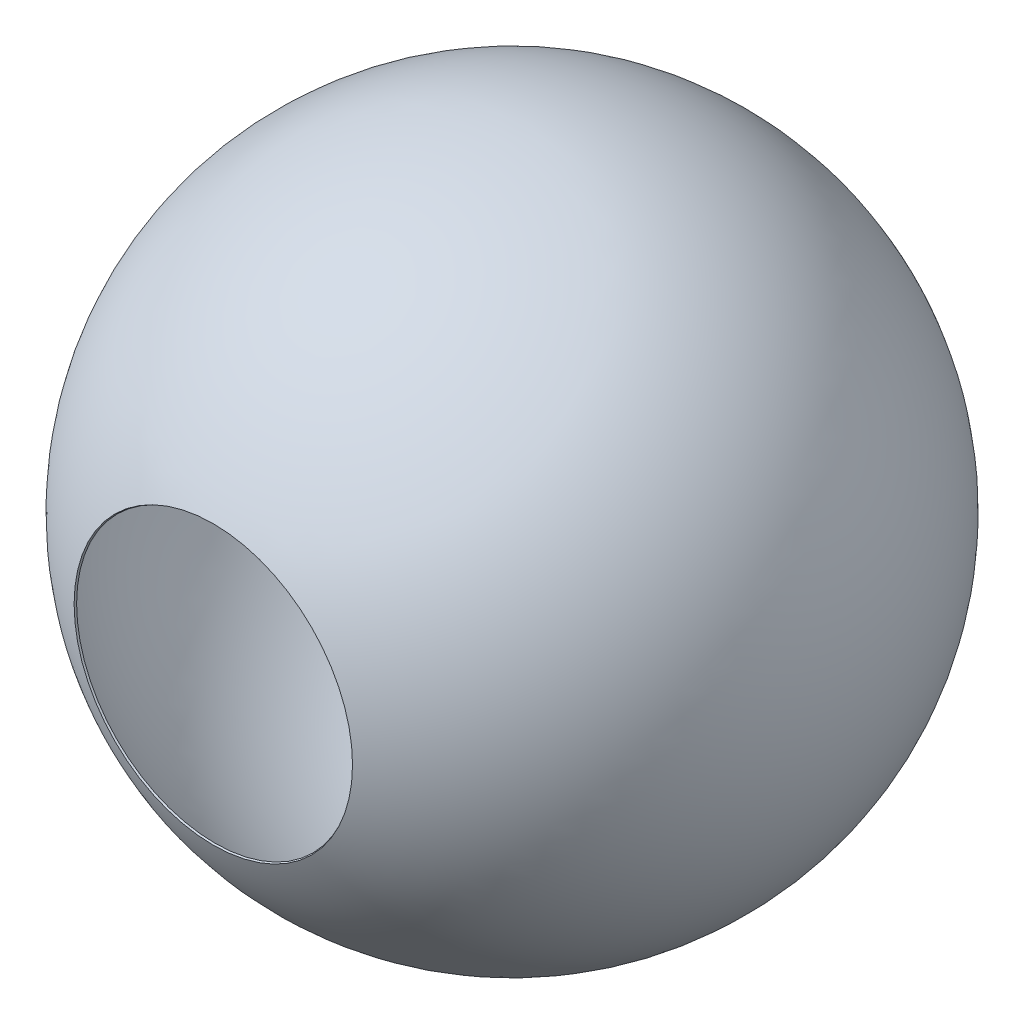
ISO-10303-21;
HEADER;
FILE_DESCRIPTION(('STEP AP214'),'2;1');
FILE_NAME('part.step','',(''),(''),'','','');
FILE_SCHEMA(('AUTOMOTIVE_DESIGN { 1 0 10303 214 1 1 1 1 }'));
ENDSEC;
DATA;
#1=APPLICATION_CONTEXT('core data for automotive mechanical design processes');
#2=APPLICATION_PROTOCOL_DEFINITION('international standard','automotive_design',2000,#1);
#3=PRODUCT_CONTEXT('',#1,'mechanical');
#4=PRODUCT('Part','Part','',(#3));
#5=PRODUCT_RELATED_PRODUCT_CATEGORY('part','',(#4));
#6=PRODUCT_DEFINITION_FORMATION('','',#4);
#7=PRODUCT_DEFINITION_CONTEXT('part definition',#1,'design');
#8=PRODUCT_DEFINITION('design','',#6,#7);
#9=PRODUCT_DEFINITION_SHAPE('','',#8);
#10=(LENGTH_UNIT() NAMED_UNIT(*) SI_UNIT(.MILLI.,.METRE.));
#11=(NAMED_UNIT(*) PLANE_ANGLE_UNIT() SI_UNIT($,.RADIAN.));
#12=(NAMED_UNIT(*) SI_UNIT($,.STERADIAN.) SOLID_ANGLE_UNIT());
#13=UNCERTAINTY_MEASURE_WITH_UNIT(LENGTH_MEASURE(1.E-05),#10,'distance_accuracy_value','');
#14=(GEOMETRIC_REPRESENTATION_CONTEXT(3) GLOBAL_UNCERTAINTY_ASSIGNED_CONTEXT((#13)) GLOBAL_UNIT_ASSIGNED_CONTEXT((#10,
#11,#12)) REPRESENTATION_CONTEXT('',''));
#15=CARTESIAN_POINT('',(0.,0.,0.));
#16=DIRECTION('',(0.,0.,1.));
#17=DIRECTION('',(1.,0.,0.));
#18=AXIS2_PLACEMENT_3D('',#15,#16,#17);
#19=CARTESIAN_POINT('',(0.,125.,-531.601551916471));
#20=DIRECTION('',(0.,0.,1.));
#21=DIRECTION('',(0.,-1.,0.));
#22=AXIS2_PLACEMENT_3D('',#19,#20,#21);
#23=PLANE('',#22);
#24=CARTESIAN_POINT('',(0.,3.19189119579733E-13,-531.601551916471));
#25=DIRECTION('',(0.,0.,1.));
#26=DIRECTION('',(0.,-1.,0.));
#27=AXIS2_PLACEMENT_3D('',#24,#25,#26);
#28=CIRCLE('',#27,125.);
#29=CARTESIAN_POINT('',(0.,125.,-531.601551916471));
#30=VERTEX_POINT('',#29);
#31=EDGE_CURVE('E10',#30,#30,#28,.T.);
#32=ORIENTED_EDGE('',*,*,#31,.F.);
#33=EDGE_LOOP('',(#32));
#34=FACE_BOUND('',#33,.T.);
#35=ADVANCED_FACE('F30',(#34),#23,.F.);
#36=CARTESIAN_POINT('',(0.,0.,0.));
#37=DIRECTION('',(0.,0.,1.));
#38=DIRECTION('',(0.,1.,0.));
#39=AXIS2_PLACEMENT_3D('',#36,#37,#38);
#40=SPHERICAL_SURFACE('',#39,546.1);
#41=CARTESIAN_POINT('',(0.,0.,495.));
#42=DIRECTION('',(0.,0.,1.));
#43=DIRECTION('',(0.,-1.,0.));
#44=AXIS2_PLACEMENT_3D('',#41,#42,#43);
#45=CIRCLE('',#44,230.651707125701);
#46=CARTESIAN_POINT('',(0.,230.6517071257,495.));
#47=VERTEX_POINT('',#46);
#48=EDGE_CURVE('E36',#47,#47,#45,.T.);
#49=CARTESIAN_POINT('',(0.,230.6517071257,495.));
#50=CARTESIAN_POINT('',(0.,233.841623475158,493.513621901903));
#51=CARTESIAN_POINT('',(0.,237.017167923415,491.996400730098));
#52=CARTESIAN_POINT('',(0.,243.338334990175,488.900857304928));
#53=CARTESIAN_POINT('',(0.,246.483957608678,487.322535051562));
#54=CARTESIAN_POINT('',(0.,252.744102988575,484.105374529126));
#55=CARTESIAN_POINT('',(0.,255.85862574997,482.466536260054));
#56=CARTESIAN_POINT('',(0.,262.055408008267,479.128957508647));
#57=CARTESIAN_POINT('',(0.,265.13766750517,477.430217026311));
#58=CARTESIAN_POINT('',(0.,271.268771082452,473.973468399462));
#59=CARTESIAN_POINT('',(0.,274.317615162832,472.215460254949));
#60=CARTESIAN_POINT('',(0.,280.380748459058,468.640833445209));
#61=CARTESIAN_POINT('',(0.,283.395037674904,466.824214779983));
#62=CARTESIAN_POINT('',(0.,289.387934651151,463.133045858016));
#63=CARTESIAN_POINT('',(0.,292.366542411552,461.258495601275));
#64=CARTESIAN_POINT('',(0.,298.286963237245,457.452164108727));
#65=CARTESIAN_POINT('',(0.,301.228776302538,455.520382872918));
#66=CARTESIAN_POINT('',(0.,307.074508246087,451.600311416081));
#67=CARTESIAN_POINT('',(0.,309.978427124342,449.612021195052));
#68=CARTESIAN_POINT('',(0.,315.747285365801,445.579674883896));
#69=CARTESIAN_POINT('',(0.,318.612224729004,443.535618793769));
#70=CARTESIAN_POINT('',(0.,324.302053180482,439.392504702207));
#71=CARTESIAN_POINT('',(0.,327.126942268758,437.293446700772));
#72=CARTESIAN_POINT('',(0.,332.735614379223,433.041113301295));
#73=CARTESIAN_POINT('',(0.,335.519397401411,430.887837903252));
#74=CARTESIAN_POINT('',(0.,341.044816951747,426.527874488755));
#75=CARTESIAN_POINT('',(0.,343.786453479896,424.321186472301));
#76=CARTESIAN_POINT('',(0.,349.226555366293,419.855222561943));
#77=CARTESIAN_POINT('',(0.,351.925020724542,417.59594666804));
#78=CARTESIAN_POINT('',(0.,357.277771730332,413.025651398257));
#79=CARTESIAN_POINT('',(0.,359.932057377874,410.714632022377));
#80=CARTESIAN_POINT('',(0.,365.195456933438,406.041713523036));
#81=CARTESIAN_POINT('',(0.,367.804570841461,403.679814399574));
#82=CARTESIAN_POINT('',(0.,372.976651771931,398.906019155572));
#83=CARTESIAN_POINT('',(0.,375.539618794379,396.494123035031));
#84=CARTESIAN_POINT('',(0.,380.618448054866,391.621235233549));
#85=CARTESIAN_POINT('',(0.,383.134310292904,389.16024355261));
#86=CARTESIAN_POINT('',(0.,388.117989690961,384.190084416286));
#87=CARTESIAN_POINT('',(0.,390.585806850979,381.680916960902));
#88=CARTESIAN_POINT('',(0.,395.472473756047,376.615344067151));
#89=CARTESIAN_POINT('',(0.,397.891323501096,374.058938628783));
#90=CARTESIAN_POINT('',(0.,402.679151540654,368.899845215534));
#91=CARTESIAN_POINT('',(0.,405.048129835162,366.297157240653));
#92=CARTESIAN_POINT('',(0.,409.735329577323,361.046471498764));
#93=CARTESIAN_POINT('',(0.,412.053551024977,358.398473731756));
#94=CARTESIAN_POINT('',(0.,416.638370647289,353.058158084356));
#95=CARTESIAN_POINT('',(0.,418.904968821946,350.365840203964));
#96=CARTESIAN_POINT('',(0.,423.38569476612,344.937890573007));
#97=CARTESIAN_POINT('',(0.,425.599822535635,342.202258822442));
#98=CARTESIAN_POINT('',(0.,429.974780147985,336.688703882737));
#99=CARTESIAN_POINT('',(0.,432.135609990819,333.910780693598));
#100=CARTESIAN_POINT('',(0.,436.403164148158,328.313681114604));
#101=CARTESIAN_POINT('',(0.,438.509888462662,325.494504724748));
#102=CARTESIAN_POINT('',(0.,442.66844418342,319.815952400401));
#103=CARTESIAN_POINT('',(0.,444.720275589674,316.95657646591));
#104=CARTESIAN_POINT('',(0.,448.768278630019,311.19869373279));
#105=CARTESIAN_POINT('',(0.,450.764450264111,308.300186934163));
#106=CARTESIAN_POINT('',(0.,454.70038769884,302.46512577828));
#107=CARTESIAN_POINT('',(0.,456.640153499477,299.528571421024));
#108=CARTESIAN_POINT('',(0.,460.462554287466,293.618512673517));
#109=CARTESIAN_POINT('',(0.,462.345189274817,290.645008283266));
#110=CARTESIAN_POINT('',(0.,466.052624808815,284.66216080533));
#111=CARTESIAN_POINT('',(0.,467.877425355463,281.652817717646));
#112=CARTESIAN_POINT('',(0.,471.468509996033,275.599417574977));
#113=CARTESIAN_POINT('',(0.,473.234794089955,272.555360519993));
#114=CARTESIAN_POINT('',(0.,476.708185683347,266.433670147069));
#115=CARTESIAN_POINT('',(0.,478.415293182816,263.356036829129));
#116=CARTESIAN_POINT('',(0.,481.769693562594,257.168344183631));
#117=CARTESIAN_POINT('',(0.,483.416986442901,254.058284856073));
#118=CARTESIAN_POINT('',(0.,486.651141915124,247.806902563773));
#119=CARTESIAN_POINT('',(0.,488.23800450704,244.66557959903));
#120=CARTESIAN_POINT('',(0.,491.350706318831,238.352844089454));
#121=CARTESIAN_POINT('',(0.,492.876545538707,235.18143154462));
#122=CARTESIAN_POINT('',(0.,495.866630330016,228.809702177817));
#123=CARTESIAN_POINT('',(0.,497.330875901449,225.609385355848));
#124=CARTESIAN_POINT('',(0.,500.197226139854,219.18104354059));
#125=CARTESIAN_POINT('',(0.,501.599330806825,215.953018547301));
#126=CARTESIAN_POINT('',(0.,504.340875205206,209.47046685104));
#127=CARTESIAN_POINT('',(0.,505.680314936615,206.215940148067));
#128=CARTESIAN_POINT('',(0.,508.296028853545,199.681601398983));
#129=CARTESIAN_POINT('',(0.,509.572303039064,196.401789352872));
#130=CARTESIAN_POINT('',(0.,512.061208861761,189.818105734353));
#131=CARTESIAN_POINT('',(0.,513.273840498937,186.514234161946));
#132=CARTESIAN_POINT('',(0.,515.635008008646,179.883666299833));
#133=CARTESIAN_POINT('',(0.,516.783543881178,176.556970010126));
#134=CARTESIAN_POINT('',(0.,519.016090600836,169.881996053058));
#135=CARTESIAN_POINT('',(0.,520.100101447961,166.533718385696));
#136=CARTESIAN_POINT('',(0.,522.203192972019,159.816833078916));
#137=CARTESIAN_POINT('',(0.,523.222273648951,156.448225439498));
#138=CARTESIAN_POINT('',(0.,525.195123955229,149.691939192453));
#139=CARTESIAN_POINT('',(0.,526.148893584576,146.304260584825));
#140=CARTESIAN_POINT('',(0.,527.990765328038,139.511098532906));
#141=CARTESIAN_POINT('',(0.,528.878867442154,136.105615088615));
#142=CARTESIAN_POINT('',(0.,530.589072230486,129.278116149401));
#143=CARTESIAN_POINT('',(0.,531.411174904702,125.856100654479));
#144=CARTESIAN_POINT('',(0.,532.989073555595,118.996816578826));
#145=CARTESIAN_POINT('',(0.,533.744869532272,115.559547998095));
#146=CARTESIAN_POINT('',(0.,535.189872312316,108.671042416428));
#147=CARTESIAN_POINT('',(0.,535.879079115682,105.219805415491));
#148=CARTESIAN_POINT('',(0.,537.190645960776,98.3046528796575));
#149=CARTESIAN_POINT('',(0.,537.813006002503,94.8407373447602));
#150=CARTESIAN_POINT('',(0.,538.9906467197,87.9015223658021));
#151=CARTESIAN_POINT('',(0.,539.54592739517,84.4262229217412));
#152=CARTESIAN_POINT('',(0.,540.589201845888,77.4655390039443));
#153=CARTESIAN_POINT('',(0.,541.077195621135,73.9801545302082));
#154=CARTESIAN_POINT('',(0.,541.985713885654,67.0006032017894));
#155=CARTESIAN_POINT('',(0.,542.406238374926,63.5064363471067));
#156=CARTESIAN_POINT('',(0.,543.17966089812,56.5106261879034));
#157=CARTESIAN_POINT('',(0.,543.532558932043,53.0089828833828));
#158=CARTESIAN_POINT('',(0.,544.17059665029,45.9995285499064));
#159=CARTESIAN_POINT('',(0.,544.455736334613,42.4917175209505));
#160=CARTESIAN_POINT('',(0.,544.958150783825,35.4712387691687));
#161=CARTESIAN_POINT('',(0.,545.175425548714,31.9585710463428));
#162=CARTESIAN_POINT('',(0.,545.54202895347,24.9296917525564));
#163=CARTESIAN_POINT('',(0.,545.691357593336,21.413480181596));
#164=CARTESIAN_POINT('',(0.,545.922012937055,14.3788273617753));
#165=CARTESIAN_POINT('',(0.,546.003339640907,10.8603861129151));
#166=CARTESIAN_POINT('',(0.,546.097960717063,3.82258894086297));
#167=CARTESIAN_POINT('',(0.,546.111255089366,0.303233017671121));
#168=CARTESIAN_POINT('',(0.,546.069806533704,-6.7350781576202));
#169=CARTESIAN_POINT('',(0.,546.015063605738,-10.2540334097197));
#170=CARTESIAN_POINT('',(0.,545.837560909492,-17.2902280471514));
#171=CARTESIAN_POINT('',(0.,545.714801141211,-20.8074674324836));
#172=CARTESIAN_POINT('',(0.,545.401310645316,-27.8389157820045));
#173=CARTESIAN_POINT('',(0.,545.210579917701,-31.3531247461931));
#174=CARTESIAN_POINT('',(0.,544.761218787994,-38.3771988316585));
#175=CARTESIAN_POINT('',(0.,544.502588385903,-41.8870639529352));
#176=CARTESIAN_POINT('',(0.,543.91752456934,-48.9011385543025));
#177=CARTESIAN_POINT('',(0.,543.591091154868,-52.4053480343931));
#178=CARTESIAN_POINT('',(0.,542.870543316746,-59.4068016688874));
#179=CARTESIAN_POINT('',(0.,542.476428893097,-62.9040458232913));
#180=CARTESIAN_POINT('',(0.,541.620666335335,-69.8902617251748));
#181=CARTESIAN_POINT('',(0.,541.159018201223,-73.3792334726545));
#182=CARTESIAN_POINT('',(0.,540.168360761709,-80.3476005712317));
#183=CARTESIAN_POINT('',(0.,539.639351456307,-83.8269959223291));
#184=CARTESIAN_POINT('',(0.,538.514169389359,-90.7749098178244));
#185=CARTESIAN_POINT('',(0.,537.917996627814,-94.2434283622222));
#186=CARTESIAN_POINT('',(0.,536.658710465801,-101.168292299164));
#187=CARTESIAN_POINT('',(0.,535.995597065335,-104.624637691709));
#188=CARTESIAN_POINT('',(0.,534.602677461504,-111.523863529457));
#189=CARTESIAN_POINT('',(0.,533.87287125814,-114.966743974662));
#190=CARTESIAN_POINT('',(0.,532.34683881071,-121.837753154716));
#191=CARTESIAN_POINT('',(0.,531.550612566645,-125.265881889566));
#192=CARTESIAN_POINT('',(0.,529.892037624237,-132.106106399289));
#193=CARTESIAN_POINT('',(0.,529.029688925895,-135.518202174162));
#194=CARTESIAN_POINT('',(0.,527.239191374365,-142.325085506566));
#195=CARTESIAN_POINT('',(0.,526.311042521178,-145.719873064097));
#196=CARTESIAN_POINT('',(0.,524.389291551939,-152.49087117333));
#197=CARTESIAN_POINT('',(0.,523.395689435888,-155.867081725031));
#198=CARTESIAN_POINT('',(0.,521.343403295801,-162.599663977199));
#199=CARTESIAN_POINT('',(0.,520.284719271765,-165.956035677665));
#200=CARTESIAN_POINT('',(0.,518.102664994697,-172.647685796651));
#201=CARTESIAN_POINT('',(0.,516.979294741664,-175.98296421517));
#202=CARTESIAN_POINT('',(0.,514.668287861811,-182.631181223081));
#203=CARTESIAN_POINT('',(0.,513.480651234991,-185.944119812472));
#204=CARTESIAN_POINT('',(0.,511.04155548208,-192.546418964368));
#205=CARTESIAN_POINT('',(0.,509.790096355988,-195.835779526873));
#206=CARTESIAN_POINT('',(0.,507.223823332455,-202.389693239433));
#207=CARTESIAN_POINT('',(0.,505.909009435014,-205.654246389488));
#208=CARTESIAN_POINT('',(0.,503.216518275302,-212.157325163259));
#209=CARTESIAN_POINT('',(0.,501.83884101303,-215.395850786974));
#210=CARTESIAN_POINT('',(0.,499.021138025111,-221.84566412186));
#211=CARTESIAN_POINT('',(0.,497.581112299463,-225.05695183303));
#212=CARTESIAN_POINT('',(0.,494.639250588738,-231.451089136683));
#213=CARTESIAN_POINT('',(0.,493.137414603662,-234.633938729166));
#214=CARTESIAN_POINT('',(0.,490.072493679367,-240.970010217937));
#215=CARTESIAN_POINT('',(0.,488.509408740149,-244.123232114226));
#216=CARTESIAN_POINT('',(0.,485.322574104416,-250.398869706334));
#217=CARTESIAN_POINT('',(0.,483.6988244079,-253.521285402155));
#218=CARTESIAN_POINT('',(0.,480.391267127631,-259.734143602752));
#219=CARTESIAN_POINT('',(0.,478.707459543876,-262.824586107529));
#220=CARTESIAN_POINT('',(0.,475.280415805584,-268.972342885317));
#221=CARTESIAN_POINT('',(0.,473.537179651048,-272.029657158328));
#222=CARTESIAN_POINT('',(0.,469.991930298843,-278.110014813407));
#223=CARTESIAN_POINT('',(0.,468.189917101174,-281.133058195476));
#224=CARTESIAN_POINT('',(0.,464.527787158047,-287.143744218107));
#225=CARTESIAN_POINT('',(0.,462.667670412588,-290.131386858669));
#226=CARTESIAN_POINT('',(0.,458.890028585191,-296.070154778608));
#227=CARTESIAN_POINT('',(0.,456.972503503252,-299.021280057985));
#228=CARTESIAN_POINT('',(0.,453.080761670349,-304.885910284097));
#229=CARTESIAN_POINT('',(0.,451.106544919384,-307.799415230832));
#230=CARTESIAN_POINT('',(0.,447.102157604166,-313.587715880653));
#231=CARTESIAN_POINT('',(0.,445.071987039914,-316.462511583739));
#232=CARTESIAN_POINT('',(0.,440.95645086638,-322.172319302685));
#233=CARTESIAN_POINT('',(0.,438.871085257099,-325.007331318544));
#234=CARTESIAN_POINT('',(0.,434.645938390695,-330.636512088454));
#235=CARTESIAN_POINT('',(0.,432.506157133573,-333.430680842503));
#236=CARTESIAN_POINT('',(0.,428.172978706309,-338.977130779219));
#237=CARTESIAN_POINT('',(0.,425.979581536169,-341.729411961886));
#238=CARTESIAN_POINT('',(0.,421.539991056428,-347.191058101576));
#239=CARTESIAN_POINT('',(0.,419.293797746828,-349.9004230586));
#240=CARTESIAN_POINT('',(0.,414.749454494078,-355.275224132517));
#241=CARTESIAN_POINT('',(0.,412.451304550928,-357.94066024941));
#242=CARTESIAN_POINT('',(0.,407.803906955572,-363.226607446808));
#243=CARTESIAN_POINT('',(0.,405.454659303366,-365.847118527312));
#244=CARTESIAN_POINT('',(0.,400.705944311963,-371.042236246231));
#245=CARTESIAN_POINT('',(0.,398.306476972766,-373.616842884645));
#246=CARTESIAN_POINT('',(0.,393.458219398853,-378.719189470285));
#247=CARTESIAN_POINT('',(0.,391.009429164137,-381.246929417512));
#248=CARTESIAN_POINT('',(0.,386.063441024901,-386.25459788792));
#249=CARTESIAN_POINT('',(0.,383.566243120379,-388.734526411103));
#250=CARTESIAN_POINT('',(0.,378.524372959417,-393.645645169899));
#251=CARTESIAN_POINT('',(0.,375.979700702977,-396.076835405513));
#252=CARTESIAN_POINT('',(0.,370.843832899418,-400.889568941391));
#253=CARTESIAN_POINT('',(0.,368.2526373523,-403.271112241655));
#254=CARTESIAN_POINT('',(0.,363.024691416521,-407.983661814399));
#255=CARTESIAN_POINT('',(0.,360.38794102786,-410.314668086878));
#256=CARTESIAN_POINT('',(0.,355.069870884077,-414.925272399634));
#257=CARTESIAN_POINT('',(0.,352.388551128954,-417.20487043991));
#258=CARTESIAN_POINT('',(0.,346.982344384951,-421.711806297463));
#259=CARTESIAN_POINT('',(0.,344.257457396071,-423.93914411474));
#260=CARTESIAN_POINT('',(0.,338.76513460034,-428.340727067552));
#261=CARTESIAN_POINT('',(0.,335.997698793489,-430.514972203088));
#262=CARTESIAN_POINT('',(0.,330.421312680057,-434.809557176856));
#263=CARTESIAN_POINT('',(0.,327.612362373476,-436.929897015089));
#264=CARTESIAN_POINT('',(0.,321.953997094704,-441.115878925583));
#265=CARTESIAN_POINT('',(0.,319.104582122513,-443.181520997844));
#266=CARTESIAN_POINT('',(0.,313.366352470152,-447.2573353508));
#267=CARTESIAN_POINT('',(0.,310.477537789982,-449.267507631496));
#268=CARTESIAN_POINT('',(0.,304.66158840478,-453.231631107343));
#269=CARTESIAN_POINT('',(0.,301.734453699747,-455.185582302494));
#270=CARTESIAN_POINT('',(0.,295.842958269894,-459.036533325686));
#271=CARTESIAN_POINT('',(0.,292.878597545074,-460.933533153725));
#272=CARTESIAN_POINT('',(0.,286.913757993798,-464.669872446474));
#273=CARTESIAN_POINT('',(0.,283.913279167343,-466.509211911182));
#274=CARTESIAN_POINT('',(0.,277.877324829949,-470.129543031383));
#275=CARTESIAN_POINT('',(0.,274.841849319011,-471.910534686875));
#276=CARTESIAN_POINT('',(0.,268.737036109675,-475.413504550021));
#277=CARTESIAN_POINT('',(0.,265.667698411277,-477.135482757676));
#278=CARTESIAN_POINT('',(0.,259.496307979907,-480.51978214257));
#279=CARTESIAN_POINT('',(0.,256.394255246935,-482.182103319809));
#280=CARTESIAN_POINT('',(0.,250.158594126414,-485.446467357877));
#281=CARTESIAN_POINT('',(0.,247.024985738866,-487.048510218704));
#282=CARTESIAN_POINT('',(0.,240.727384482995,-490.191718866732));
#283=CARTESIAN_POINT('',(0.,237.563391614671,-491.732884653933));
#284=CARTESIAN_POINT('',(0.,231.206203927132,-494.753763150068));
#285=CARTESIAN_POINT('',(0.,228.013009107917,-496.233475859003));
#286=CARTESIAN_POINT('',(0.,221.59861096258,-499.130895161772));
#287=CARTESIAN_POINT('',(0.,218.377407636459,-500.548601755604));
#288=CARTESIAN_POINT('',(0.,211.908196389409,-503.321478966047));
#289=CARTESIAN_POINT('',(0.,208.660188468481,-504.676649582656));
#290=CARTESIAN_POINT('',(0.,202.138581961864,-507.32394834845));
#291=CARTESIAN_POINT('',(0.,198.864983376174,-508.616076497636));
#292=CARTESIAN_POINT('',(0.,192.293419035111,-511.1368074027));
#293=CARTESIAN_POINT('',(0.,188.995453279738,-512.365410158578));
#294=CARTESIAN_POINT('',(0.,182.376387199191,-514.758631084393));
#295=CARTESIAN_POINT('',(0.,179.055286874017,-515.92324925433));
#296=CARTESIAN_POINT('',(0.,172.391192908903,-518.18806576364));
#297=CARTESIAN_POINT('',(0.,169.048199268963,-519.288264103013));
#298=CARTESIAN_POINT('',(0.,162.341568079429,-521.423829656245));
#299=CARTESIAN_POINT('',(0.,158.977930529834,-522.459196870103));
#300=CARTESIAN_POINT('',(0.,152.231268762838,-524.464713581661));
#301=CARTESIAN_POINT('',(0.,148.848244545435,-525.434863079361));
#302=CARTESIAN_POINT('',(0.,142.064073478206,-527.309580374088));
#303=CARTESIAN_POINT('',(0.,138.662926628379,-528.214148171115));
#304=CARTESIAN_POINT('',(0.,131.843782792405,-529.957369191897));
#305=CARTESIAN_POINT('',(0.,128.425785806257,-530.796022415652));
#306=CARTESIAN_POINT('',(0.,125.,-531.601551916471));
#307=B_SPLINE_CURVE_WITH_KNOTS('',3,(#49,#50,#51,#52,#53,#54,#55,#56,#57,#58,#59,#60,#61,#62,
#63,#64,#65,#66,#67,#68,#69,#70,#71,#72,#73,#74,#75,#76,#77,#78,#79,#80,#81,#82,#83,#84,#85,#86,
#87,#88,#89,#90,#91,#92,#93,#94,#95,#96,#97,#98,#99,#100,#101,#102,#103,#104,#105,#106,#107,
#108,#109,#110,#111,#112,#113,#114,#115,#116,#117,#118,#119,#120,#121,#122,#123,#124,#125,#126,
#127,#128,#129,#130,#131,#132,#133,#134,#135,#136,#137,#138,#139,#140,#141,#142,#143,#144,#145,
#146,#147,#148,#149,#150,#151,#152,#153,#154,#155,#156,#157,#158,#159,#160,#161,#162,#163,#164,
#165,#166,#167,#168,#169,#170,#171,#172,#173,#174,#175,#176,#177,#178,#179,#180,#181,#182,#183,
#184,#185,#186,#187,#188,#189,#190,#191,#192,#193,#194,#195,#196,#197,#198,#199,#200,#201,#202,
#203,#204,#205,#206,#207,#208,#209,#210,#211,#212,#213,#214,#215,#216,#217,#218,#219,#220,#221,
#222,#223,#224,#225,#226,#227,#228,#229,#230,#231,#232,#233,#234,#235,#236,#237,#238,#239,#240,
#241,#242,#243,#244,#245,#246,#247,#248,#249,#250,#251,#252,#253,#254,#255,#256,#257,#258,#259,
#260,#261,#262,#263,#264,#265,#266,#267,#268,#269,#270,#271,#272,#273,#274,#275,#276,#277,#278,
#279,#280,#281,#282,#283,#284,#285,#286,#287,#288,#289,#290,#291,#292,#293,#294,#295,#296,#297,
#298,#299,#300,#301,#302,#303,#304,#305,#306),.UNSPECIFIED.,.F.,.F.,(4,2,2,2,2,2,2,2,2,2,2,2,2,
2,2,2,2,2,2,2,2,2,2,2,2,2,2,2,2,2,2,2,2,2,2,2,2,2,2,2,2,2,2,2,2,2,2,2,2,2,2,2,2,2,2,2,2,2,2,2,2,
2,2,2,2,2,2,2,2,2,2,2,2,2,2,2,2,2,2,2,2,2,2,2,2,2,2,2,2,2,2,2,2,2,2,2,2,2,2,2,2,2,2,2,2,2,2,2,2,
2,2,2,2,2,2,2,2,2,2,2,2,2,2,2,2,2,2,2,4),(0.,10.5574854211696,21.1149708423392,31.6724562635089,
42.2299416846784,52.7874271058481,63.3449125270177,73.9023979481873,84.4598833693569,
95.0173687905265,105.574854211696,116.132339632866,126.689825054035,137.247310475205,
147.804795896375,158.362281317544,168.919766738714,179.477252159883,190.034737581053,
200.592223002223,211.149708423392,221.707193844562,232.264679265732,242.822164686901,
253.379650108071,263.93713552924,274.49462095041,285.052106371579,295.609591792749,
306.167077213919,316.724562635088,327.282048056258,337.839533477428,348.397018898597,
358.954504319767,369.511989740936,380.069475162106,390.626960583276,401.184446004445,
411.741931425615,422.299416846785,432.856902267954,443.414387689124,453.971873110293,
464.529358531463,475.086843952633,485.644329373802,496.201814794972,506.759300216141,
517.316785637311,527.874271058481,538.43175647965,548.98924190082,559.546727321989,
570.104212743159,580.661698164329,591.219183585498,601.776669006668,612.334154427837,
622.891639849007,633.449125270177,644.006610691346,654.564096112516,665.121581533686,
675.679066954855,686.236552376025,696.794037797194,707.351523218364,717.909008639533,
728.466494060703,739.023979481873,749.581464903043,760.138950324212,770.696435745382,
781.253921166551,791.811406587721,802.36889200889,812.92637743006,823.48386285123,
834.041348272399,844.598833693569,855.156319114738,865.713804535908,876.271289957078,
886.828775378247,897.386260799417,907.943746220587,918.501231641756,929.058717062926,
939.616202484096,950.173687905265,960.731173326435,971.288658747604,981.846144168774,
992.403629589944,1002.96111501111,1013.51860043228,1024.07608585345,1034.63357127462,
1045.19105669579,1055.74854211696,1066.30602753813,1076.8635129593,1087.42099838047,
1097.97848380164,1108.53596922281,1119.09345464398,1129.65094006515,1140.20842548632,
1150.76591090749,1161.32339632866,1171.88088174983,1182.438367171,1192.99585259217,
1203.55333801334,1214.11082343451,1224.66830885568,1235.22579427685,1245.78327969801,
1256.34076511918,1266.89825054035,1277.45573596152,1288.01322138269,1298.57070680386,
1309.12819222503,1319.6856776462,1330.24316306737,1340.80064848854,1351.35813390971),.UNSPECIFIED.);
#308=EDGE_CURVE('BSEAM60',#47,#30,#307,.T.);
#309=ORIENTED_EDGE('',*,*,#48,.F.);
#310=ORIENTED_EDGE('',*,*,#31,.T.);
#311=ORIENTED_EDGE('',*,*,#308,.T.);
#312=ORIENTED_EDGE('',*,*,#308,.F.);
#313=EDGE_LOOP('',(#309,#311,#310,#312));
#314=FACE_BOUND('',#313,.T.);
#315=ADVANCED_FACE('F60',(#314),#40,.T.);
#316=CARTESIAN_POINT('',(0.,0.,495.));
#317=DIRECTION('',(0.,0.,1.));
#318=DIRECTION('',(0.,-1.,0.));
#319=AXIS2_PLACEMENT_3D('',#316,#317,#318);
#320=CONICAL_SURFACE('',#319,230.651707125701,0.436049212280005);
#321=CARTESIAN_POINT('',(0.,0.,492.190075077824));
#322=DIRECTION('',(0.,0.,1.));
#323=DIRECTION('',(0.,-1.,0.));
#324=AXIS2_PLACEMENT_3D('',#321,#322,#323);
#325=CIRCLE('',#324,229.34238595359);
#326=CARTESIAN_POINT('',(0.,229.34238595359,492.190075077825));
#327=VERTEX_POINT('',#326);
#328=EDGE_CURVE('E40',#327,#327,#325,.T.);
#329=ORIENTED_EDGE('',*,*,#328,.F.);
#330=EDGE_LOOP('',(#329));
#331=FACE_BOUND('',#330,.T.);
#332=ORIENTED_EDGE('',*,*,#48,.T.);
#333=EDGE_LOOP('',(#332));
#334=FACE_BOUND('',#333,.T.);
#335=ADVANCED_FACE('F55',(#331,#334),#320,.F.);
#336=CARTESIAN_POINT('',(0.,0.,0.));
#337=DIRECTION('',(0.,0.,1.));
#338=DIRECTION('',(0.,1.,0.));
#339=AXIS2_PLACEMENT_3D('',#336,#337,#338);
#340=SPHERICAL_SURFACE('',#339,543.);
#341=CARTESIAN_POINT('',(0.,3.18225273120656E-13,-528.50155191647));
#342=DIRECTION('',(0.,0.,1.));
#343=DIRECTION('',(0.,-1.,0.));
#344=AXIS2_PLACEMENT_3D('',#341,#342,#343);
#345=CIRCLE('',#344,124.63991985669);
#346=CARTESIAN_POINT('',(0.,124.639919856691,-528.50155191647));
#347=VERTEX_POINT('',#346);
#348=EDGE_CURVE('E44',#347,#347,#345,.T.);
#349=CARTESIAN_POINT('',(0.,124.639919856691,-528.50155191647));
#350=CARTESIAN_POINT('',(0.,128.044818339713,-527.698557468621));
#351=CARTESIAN_POINT('',(0.,131.44195459108,-526.862650058009));
#352=CARTESIAN_POINT('',(0.,138.219438588638,-525.125340856513));
#353=CARTESIAN_POINT('',(0.,141.59978633483,-524.223939065628));
#354=CARTESIAN_POINT('',(0.,148.342429280173,-522.355972648839));
#355=CARTESIAN_POINT('',(0.,151.704724479324,-521.389408022935));
#356=CARTESIAN_POINT('',(0.,158.410006712572,-519.391478378126));
#357=CARTESIAN_POINT('',(0.,161.752993746669,-518.360113359221));
#358=CARTESIAN_POINT('',(0.,168.418410794027,-516.23296781986));
#359=CARTESIAN_POINT('',(0.,171.740840807289,-515.137187299404));
#360=CARTESIAN_POINT('',(0.,178.363902756847,-512.881620181223));
#361=CARTESIAN_POINT('',(0.,181.664534693143,-511.721833583499));
#362=CARTESIAN_POINT('',(0.,188.2427675429,-509.33868751819));
#363=CARTESIAN_POINT('',(0.,191.520368456362,-508.115328050606));
#364=CARTESIAN_POINT('',(0.,198.051314926401,-505.60549323419));
#365=CARTESIAN_POINT('',(0.,201.304660482978,-504.319017885359));
#366=CARTESIAN_POINT('',(0.,207.785880963378,-501.683431862716));
#367=CARTESIAN_POINT('',(0.,211.0137558872,-500.334321188904));
#368=CARTESIAN_POINT('',(0.,217.442829341301,-497.573968472191));
#369=CARTESIAN_POINT('',(0.,220.64402787158,-496.162726429289));
#370=CARTESIAN_POINT('',(0.,227.018552742511,-493.278638138582));
#371=CARTESIAN_POINT('',(0.,230.191879083164,-491.805791890777));
#372=CARTESIAN_POINT('',(0.,236.509474190356,-488.79904536665));
#373=CARTESIAN_POINT('',(0.,239.653742956896,-487.265145090329));
#374=CARTESIAN_POINT('',(0.,245.912048385719,-484.136863492019));
#375=CARTESIAN_POINT('',(0.,249.026085048001,-482.542482170032));
#376=CARTESIAN_POINT('',(0.,255.222763031258,-479.293834055728));
#377=CARTESIAN_POINT('',(0.,258.305404352233,-477.639567263411));
#378=CARTESIAN_POINT('',(0.,264.438140143439,-474.271766153783));
#379=CARTESIAN_POINT('',(0.,267.488234613671,-472.558231836471));
#380=CARTESIAN_POINT('',(0.,273.554737351712,-469.072535761353));
#381=CARTESIAN_POINT('',(0.,276.571145619522,-467.300374003547));
#382=CARTESIAN_POINT('',(0.,282.569149184401,-463.69808503201));
#383=CARTESIAN_POINT('',(0.,285.55074448147,-461.867957818279));
#384=CARTESIAN_POINT('',(0.,291.478008340805,-458.150421572246));
#385=CARTESIAN_POINT('',(0.,294.423676903072,-456.263012539944));
#386=CARTESIAN_POINT('',(0.,300.277986949042,-452.431617691536));
#387=CARTESIAN_POINT('',(0.,303.186628432746,-450.487631875431));
#388=CARTESIAN_POINT('',(0.,308.965797809161,-446.543809628236));
#389=CARTESIAN_POINT('',(0.,311.836325701872,-444.543973197147));
#390=CARTESIAN_POINT('',(0.,317.538195621063,-440.489196751599));
#391=CARTESIAN_POINT('',(0.,320.369537647544,-438.43425673714));
#392=CARTESIAN_POINT('',(0.,325.991978196776,-434.270040740208));
#393=CARTESIAN_POINT('',(0.,328.783076719528,-432.160764757735));
#394=CARTESIAN_POINT('',(0.,334.323987656616,-427.888664737135));
#395=CARTESIAN_POINT('',(0.,337.073800070953,-425.725840699008));
#396=CARTESIAN_POINT('',(0.,342.531111608802,-421.347452482139));
#397=CARTESIAN_POINT('',(0.,345.238610732314,-419.131888303397));
#398=CARTESIAN_POINT('',(0.,350.610284312079,-414.648847421228));
#399=CARTESIAN_POINT('',(0.,353.274458768333,-412.381370717799));
#400=CARTESIAN_POINT('',(0.,358.558487820918,-407.795351793919));
#401=CARTESIAN_POINT('',(0.,361.17834241725,-405.476809573467));
#402=CARTESIAN_POINT('',(0.,366.372753112852,-400.789525698538));
#403=CARTESIAN_POINT('',(0.,368.947309212122,-398.420784044061));
#404=CARTESIAN_POINT('',(0.,374.050161197549,-393.633986135899));
#405=CARTESIAN_POINT('',(0.,376.578457083705,-391.215929882214));
#406=CARTESIAN_POINT('',(0.,381.587844207187,-386.33140603174));
#407=CARTESIAN_POINT('',(0.,384.068935444512,-383.864938434951));
#408=CARTESIAN_POINT('',(0.,388.982986467738,-378.884513238254));
#409=CARTESIAN_POINT('',(0.,391.415946253639,-376.370555638347));
#410=CARTESIAN_POINT('',(0.,396.232825550751,-371.296089515117));
#411=CARTESIAN_POINT('',(0.,398.616745061962,-368.735580991794));
#412=CARTESIAN_POINT('',(0.,403.334653305247,-363.568969490365));
#413=CARTESIAN_POINT('',(0.,405.66864203732,-360.962866512258));
#414=CARTESIAN_POINT('',(0.,410.28581686934,-355.706039601534));
#415=CARTESIAN_POINT('',(0.,412.569002969287,-353.055315668916));
#416=CARTESIAN_POINT('',(0.,417.083719661204,-347.710237017439));
#417=CARTESIAN_POINT('',(0.,419.315250253175,-345.015882298579));
#418=CARTESIAN_POINT('',(0.,423.725822349016,-339.584548541007));
#419=CARTESIAN_POINT('',(0.,425.904863852887,-336.847569502295));
#420=CARTESIAN_POINT('',(0.,430.209643799514,-331.332009493567));
#421=CARTESIAN_POINT('',(0.,432.335382242269,-328.553428523552));
#422=CARTESIAN_POINT('',(0.,436.532762004814,-322.955702581016));
#423=CARTESIAN_POINT('',(0.,438.604403324603,-320.136557608496));
#424=CARTESIAN_POINT('',(0.,442.692814987148,-314.458756742287));
#425=CARTESIAN_POINT('',(0.,444.709585329902,-311.600100848597));
#426=CARTESIAN_POINT('',(0.,448.687501681163,-305.844345980543));
#427=CARTESIAN_POINT('',(0.,450.648647689669,-302.947247006179));
#428=CARTESIAN_POINT('',(0.,454.514582793484,-297.115688177543));
#429=CARTESIAN_POINT('',(0.,456.419371888794,-294.181228323271));
#430=CARTESIAN_POINT('',(0.,460.17188163919,-288.27604389161));
#431=CARTESIAN_POINT('',(0.,462.019602294276,-285.305319314219));
#432=CARTESIAN_POINT('',(0.,465.657284954905,-279.328715139664));
#433=CARTESIAN_POINT('',(0.,467.447246960449,-276.322835542499));
#434=CARTESIAN_POINT('',(0.,470.968743688206,-270.277044163767));
#435=CARTESIAN_POINT('',(0.,472.70027841042,-267.2371323822));
#436=CARTESIAN_POINT('',(0.,476.10427376303,-261.124412182636));
#437=CARTESIAN_POINT('',(0.,477.776734393427,-258.051603764639));
#438=CARTESIAN_POINT('',(0.,481.061956820828,-251.874238128604));
#439=CARTESIAN_POINT('',(0.,482.674718617833,-248.769680910568));
#440=CARTESIAN_POINT('',(0.,485.839940937155,-242.529977370493));
#441=CARTESIAN_POINT('',(0.,487.392401459472,-239.394831048455));
#442=CARTESIAN_POINT('',(0.,490.436441313448,-233.095120422866));
#443=CARTESIAN_POINT('',(0.,491.928020645107,-229.930556119314));
#444=CARTESIAN_POINT('',(0.,494.849740943739,-223.573191642165));
#445=CARTESIAN_POINT('',(0.,496.279881910712,-220.380391468568));
#446=CARTESIAN_POINT('',(0.,499.078191256027,-213.967747910199));
#447=CARTESIAN_POINT('',(0.,500.446359634367,-210.747904525429));
#448=CARTESIAN_POINT('',(0.,503.120212728102,-204.282377305481));
#449=CARTESIAN_POINT('',(0.,504.425897443496,-201.036693470304));
#450=CARTESIAN_POINT('',(0.,506.974295477569,-194.520697762917));
#451=CARTESIAN_POINT('',(0.,508.217008796248,-191.250385890707));
#452=CARTESIAN_POINT('',(0.,510.638999825857,-184.686355722339));
#453=CARTESIAN_POINT('',(0.,511.818277536787,-181.392637426181));
#454=CARTESIAN_POINT('',(0.,514.112956836007,-174.783024766388));
#455=CARTESIAN_POINT('',(0.,515.228358424296,-171.467130402754));
#456=CARTESIAN_POINT('',(0.,517.394868824033,-164.814404248267));
#457=CARTESIAN_POINT('',(0.,518.445977635481,-161.477572457416));
#458=CARTESIAN_POINT('',(0.,520.483509843669,-154.784217909855));
#459=CARTESIAN_POINT('',(0.,521.469933240408,-151.427695153146));
#460=CARTESIAN_POINT('',(0.,523.377726144312,-144.696212490718));
#461=CARTESIAN_POINT('',(0.,524.299095651477,-141.321252584999));
#462=CARTESIAN_POINT('',(0.,526.076436602009,-134.55415632853));
#463=CARTESIAN_POINT('',(0.,526.932408045376,-131.162019977779));
#464=CARTESIAN_POINT('',(0.,528.578633123298,-124.361837951423));
#465=CARTESIAN_POINT('',(0.,529.368886757852,-120.953792275818));
#466=CARTESIAN_POINT('',(0.,530.883381021784,-114.123064662798));
#467=CARTESIAN_POINT('',(0.,531.60762165116,-110.700382725383));
#468=CARTESIAN_POINT('',(0.,532.989819367286,-103.841661119115));
#469=CARTESIAN_POINT('',(0.,533.647776454036,-100.405621450261));
#470=CARTESIAN_POINT('',(0.,534.897161307435,-93.5214679012143));
#471=CARTESIAN_POINT('',(0.,535.488589074084,-90.0733540210216));
#472=CARTESIAN_POINT('',(0.,536.604694361595,-83.1663400796758));
#473=CARTESIAN_POINT('',(0.,537.129371882457,-79.7074400185228));
#474=CARTESIAN_POINT('',(0.,538.111780687017,-72.7801457747737));
#475=CARTESIAN_POINT('',(0.,538.569511970715,-69.3117515921776));
#476=CARTESIAN_POINT('',(0.,539.417857317093,-62.366764711554));
#477=CARTESIAN_POINT('',(0.,539.808471379773,-58.8901720135265));
#478=CARTESIAN_POINT('',(0.,540.522436371655,-51.9300867705771));
#479=CARTESIAN_POINT('',(0.,540.845787300857,-48.4465942256553));
#480=CARTESIAN_POINT('',(0.,541.425105239223,-41.4740105348672));
#481=CARTESIAN_POINT('',(0.,541.681072248386,-37.984919389001));
#482=CARTESIAN_POINT('',(0.,542.125526731128,-31.002441833611));
#483=CARTESIAN_POINT('',(0.,542.314014204708,-27.5090554240872));
#484=CARTESIAN_POINT('',(0.,542.623439207475,-20.519292283149));
#485=CARTESIAN_POINT('',(0.,542.744376736662,-17.0229155517346));
#486=CARTESIAN_POINT('',(0.,542.918656674871,-10.028477825806));
#487=CARTESIAN_POINT('',(0.,542.971999083893,-6.53041683129179));
#488=CARTESIAN_POINT('',(0.,543.011068855908,0.46608273289526));
#489=CARTESIAN_POINT('',(0.,542.996796218901,3.96452130256812));
#490=CARTESIAN_POINT('',(0.,542.900641230351,10.9604691880896));
#491=CARTESIAN_POINT('',(0.,542.818758878808,14.4579785039382));
#492=CARTESIAN_POINT('',(0.,542.587415048038,21.4507613999475));
#493=CARTESIAN_POINT('',(0.,542.437953568812,24.9460349801082));
#494=CARTESIAN_POINT('',(0.,542.071507313468,31.9330407580291));
#495=CARTESIAN_POINT('',(0.,541.854522537351,35.4247729557893));
#496=CARTESIAN_POINT('',(0.,541.353110742097,42.403391645067));
#497=CARTESIAN_POINT('',(0.,541.06868372296,45.8902781365844));
#498=CARTESIAN_POINT('',(0.,540.432493688345,52.8579028996304));
#499=CARTESIAN_POINT('',(0.,540.080730672866,56.3386411711589));
#500=CARTESIAN_POINT('',(0.,539.31000004536,63.2926692771259));
#501=CARTESIAN_POINT('',(0.,538.891032433332,66.7659591115644));
#502=CARTESIAN_POINT('',(0.,537.986049116553,73.7037929085868));
#503=CARTESIAN_POINT('',(0.,537.500033411801,77.1683368711707));
#504=CARTESIAN_POINT('',(0.,536.46113545897,84.087384756708));
#505=CARTESIAN_POINT('',(0.,535.90825321089,87.5418886796614));
#506=CARTESIAN_POINT('',(0.,534.735828698552,94.4395660685819));
#507=CARTESIAN_POINT('',(0.,534.116286434294,97.882739534549));
#508=CARTESIAN_POINT('',(0.,532.810773317356,104.756469824592));
#509=CARTESIAN_POINT('',(0.,532.124802464675,108.187026648668));
#510=CARTESIAN_POINT('',(0.,530.686688412805,115.034242182925));
#511=CARTESIAN_POINT('',(0.,529.934545213615,118.450900893106));
#512=CARTESIAN_POINT('',(0.,528.364367429078,125.269043919158));
#513=CARTESIAN_POINT('',(0.,527.546332843731,128.670528235029));
#514=CARTESIAN_POINT('',(0.,525.844677860718,135.457051860387));
#515=CARTESIAN_POINT('',(0.,524.961057463052,138.842091169874));
#516=CARTESIAN_POINT('',(0.,523.128560928584,145.594460313361));
#517=CARTESIAN_POINT('',(0.,522.17968479178,148.961790147361));
#518=CARTESIAN_POINT('',(0.,520.217031228261,155.677482486082));
#519=CARTESIAN_POINT('',(0.,519.203253801544,159.025844990803));
#520=CARTESIAN_POINT('',(0.,517.111176351062,165.702351902351));
#521=CARTESIAN_POINT('',(0.,516.032876327296,169.030496309177));
#522=CARTESIAN_POINT('',(0.,513.812156477762,175.665323808716));
#523=CARTESIAN_POINT('',(0.,512.669736651994,178.972006901429));
#524=CARTESIAN_POINT('',(0.,510.321203945217,185.562676573318));
#525=CARTESIAN_POINT('',(0.,509.115091064209,188.846663152494));
#526=CARTESIAN_POINT('',(0.,506.639622786027,195.390713076086));
#527=CARTESIAN_POINT('',(0.,505.370267388853,198.650776420503));
#528=CARTESIAN_POINT('',(0.,502.768788241423,205.14576208979));
#529=CARTESIAN_POINT('',(0.,501.436664491167,208.38068441466));
#530=CARTESIAN_POINT('',(0.,498.710146247547,214.824179651406));
#531=CARTESIAN_POINT('',(0.,497.315751754184,218.032752563281));
#532=CARTESIAN_POINT('',(0.,494.465212895331,224.422350423313));
#533=CARTESIAN_POINT('',(0.,493.009068529843,227.60337537147));
#534=CARTESIAN_POINT('',(0.,490.035573864164,233.936689043786));
#535=CARTESIAN_POINT('',(0.,488.518223563974,237.088977767944));
#536=CARTESIAN_POINT('',(0.,485.422883829569,243.363641466292));
#537=CARTESIAN_POINT('',(0.,483.844894395355,246.486016440482));
#538=CARTESIAN_POINT('',(0.,480.628865845105,252.699686287097));
#539=CARTESIAN_POINT('',(0.,478.99082672907,255.790981159523));
#540=CARTESIAN_POINT('',(0.,475.655310698725,261.94133606067));
#541=CARTESIAN_POINT('',(0.,473.957833784415,265.000396089392));
#542=CARTESIAN_POINT('',(0.,470.504076243836,271.085138602403));
#543=CARTESIAN_POINT('',(0.,468.747795617567,274.110821086693));
#544=CARTESIAN_POINT('',(0.,465.177086705302,280.127678278169));
#545=CARTESIAN_POINT('',(0.,463.362658419305,283.118852985357));
#546=CARTESIAN_POINT('',(0.,459.676331960659,289.065577280214));
#547=CARTESIAN_POINT('',(0.,457.80443378801,292.021126867884));
#548=CARTESIAN_POINT('',(0.,454.003866796804,297.895496888925));
#549=CARTESIAN_POINT('',(0.,452.075197978246,300.814317322296));
#550=CARTESIAN_POINT('',(0.,448.161810142433,306.61413872));
#551=CARTESIAN_POINT('',(0.,446.177091125178,309.495139684333));
#552=CARTESIAN_POINT('',(0.,442.152344276527,315.218245956545));
#553=CARTESIAN_POINT('',(0.,440.112316445133,318.060351264424));
#554=CARTESIAN_POINT('',(0.,435.977714013169,323.704604565646));
#555=CARTESIAN_POINT('',(0.,433.883139412599,326.506752558988));
#556=CARTESIAN_POINT('',(0.,429.640225862998,332.070044498961));
#557=CARTESIAN_POINT('',(0.,427.491886913965,334.831188445591));
#558=CARTESIAN_POINT('',(0.,423.142247171626,340.311440876877));
#559=CARTESIAN_POINT('',(0.,420.940946378319,343.030549361533));
#560=CARTESIAN_POINT('',(0.,416.486205235321,348.425715155801));
#561=CARTESIAN_POINT('',(0.,414.232764885631,351.101772465414));
#562=CARTESIAN_POINT('',(0.,409.674586394301,356.409836278136));
#563=CARTESIAN_POINT('',(0.,407.369848252662,359.041842781246));
#564=CARTESIAN_POINT('',(0.,402.70993510397,364.260821804523));
#565=CARTESIAN_POINT('',(0.,400.354760096917,366.847794324689));
#566=CARTESIAN_POINT('',(0.,395.594852984443,371.975739027919));
#567=CARTESIAN_POINT('',(0.,393.190120879022,374.516711210981));
#568=CARTESIAN_POINT('',(0.,388.331997848728,379.5517060691));
#569=CARTESIAN_POINT('',(0.,385.878606923856,382.045728744157));
#570=CARTESIAN_POINT('',(0.,380.924082709902,386.985892953179));
#571=CARTESIAN_POINT('',(0.,378.422949420821,389.432034487144));
#572=CARTESIAN_POINT('',(0.,373.373874767678,394.275522666726));
#573=CARTESIAN_POINT('',(0.,370.825933403617,396.672869312342));
#574=CARTESIAN_POINT('',(0.,365.684194374728,401.417872195118));
#575=CARTESIAN_POINT('',(0.,363.0903967099,403.765528432278));
#576=CARTESIAN_POINT('',(0.,357.857913983148,408.410273539708));
#577=CARTESIAN_POINT('',(0.,355.219228921223,410.707362409978));
#578=CARTESIAN_POINT('',(0.,349.897957071469,415.250114714448));
#579=CARTESIAN_POINT('',(0.,347.215370283639,417.495778148648));
#580=CARTESIAN_POINT('',(0.,341.807297052596,421.934840721583));
#581=CARTESIAN_POINT('',(0.,339.081810609384,424.128239860319));
#582=CARTESIAN_POINT('',(0.,333.588956163106,428.461954506066));
#583=CARTESIAN_POINT('',(0.,330.821588160042,430.602270013077));
#584=CARTESIAN_POINT('',(0.,325.2460043343,434.829017888324));
#585=CARTESIAN_POINT('',(0.,322.437788511624,436.915450256559));
#586=CARTESIAN_POINT('',(0.,316.781558045434,441.03365247501));
#587=CARTESIAN_POINT('',(0.,313.933543401919,443.065422325225));
#588=CARTESIAN_POINT('',(0.,308.19877915961,447.073540547537));
#589=CARTESIAN_POINT('',(0.,305.312029560815,449.049888919633));
#590=CARTESIAN_POINT('',(0.,299.500873742508,452.946425927498));
#591=CARTESIAN_POINT('',(0.,296.576467522996,454.866614563265));
#592=CARTESIAN_POINT('',(0.,290.691090865413,458.650114820776));
#593=CARTESIAN_POINT('',(0.,287.730120427342,460.51342644252));
#594=CARTESIAN_POINT('',(0.,281.772721389119,464.182476632093));
#595=CARTESIAN_POINT('',(0.,278.776292788968,465.988215199923));
#596=CARTESIAN_POINT('',(0.,272.749096743672,469.541444779315));
#597=CARTESIAN_POINT('',(0.,269.718329298528,471.288935790877));
#598=CARTESIAN_POINT('',(0.,263.623587650226,474.725017396616));
#599=CARTESIAN_POINT('',(0.,260.559613447069,476.413607990794));
#600=CARTESIAN_POINT('',(0.,254.399602987675,479.731258339049));
#601=CARTESIAN_POINT('',(0.,251.303566731438,481.360318093126));
#602=CARTESIAN_POINT('',(0.,245.080588049983,484.558296947465));
#603=CARTESIAN_POINT('',(0.,241.953645624766,486.127216047726));
#604=CARTESIAN_POINT('',(0.,235.670025010631,489.204332323785));
#605=CARTESIAN_POINT('',(0.,232.513346821715,490.712529499583));
#606=CARTESIAN_POINT('',(0.,229.34238595359,492.190075077825));
#607=B_SPLINE_CURVE_WITH_KNOTS('',3,(#349,#350,#351,#352,#353,#354,#355,#356,#357,#358,#359,
#360,#361,#362,#363,#364,#365,#366,#367,#368,#369,#370,#371,#372,#373,#374,#375,#376,#377,#378,
#379,#380,#381,#382,#383,#384,#385,#386,#387,#388,#389,#390,#391,#392,#393,#394,#395,#396,#397,
#398,#399,#400,#401,#402,#403,#404,#405,#406,#407,#408,#409,#410,#411,#412,#413,#414,#415,#416,
#417,#418,#419,#420,#421,#422,#423,#424,#425,#426,#427,#428,#429,#430,#431,#432,#433,#434,#435,
#436,#437,#438,#439,#440,#441,#442,#443,#444,#445,#446,#447,#448,#449,#450,#451,#452,#453,#454,
#455,#456,#457,#458,#459,#460,#461,#462,#463,#464,#465,#466,#467,#468,#469,#470,#471,#472,#473,
#474,#475,#476,#477,#478,#479,#480,#481,#482,#483,#484,#485,#486,#487,#488,#489,#490,#491,#492,
#493,#494,#495,#496,#497,#498,#499,#500,#501,#502,#503,#504,#505,#506,#507,#508,#509,#510,#511,
#512,#513,#514,#515,#516,#517,#518,#519,#520,#521,#522,#523,#524,#525,#526,#527,#528,#529,#530,
#531,#532,#533,#534,#535,#536,#537,#538,#539,#540,#541,#542,#543,#544,#545,#546,#547,#548,#549,
#550,#551,#552,#553,#554,#555,#556,#557,#558,#559,#560,#561,#562,#563,#564,#565,#566,#567,#568,
#569,#570,#571,#572,#573,#574,#575,#576,#577,#578,#579,#580,#581,#582,#583,#584,#585,#586,#587,
#588,#589,#590,#591,#592,#593,#594,#595,#596,#597,#598,#599,#600,#601,#602,#603,#604,#605,#606),
.UNSPECIFIED.,.F.,.F.,(4,2,2,2,2,2,2,2,2,2,2,2,2,2,2,2,2,2,2,2,2,2,2,2,2,2,2,2,2,2,2,2,2,2,2,2,
2,2,2,2,2,2,2,2,2,2,2,2,2,2,2,2,2,2,2,2,2,2,2,2,2,2,2,2,2,2,2,2,2,2,2,2,2,2,2,2,2,2,2,2,2,2,2,2,
2,2,2,2,2,2,2,2,2,2,2,2,2,2,2,2,2,2,2,2,2,2,2,2,2,2,2,2,2,2,2,2,2,2,2,2,2,2,2,2,2,2,2,2,4),(0.,
10.4947496311916,20.9894992623834,31.4842488935749,41.9789985247667,52.4737481559583,
62.96849778715,73.4632474183417,83.9579970495334,94.452746680725,104.947496311917,
115.442245943108,125.9369955743,136.431745205492,146.926494836684,157.421244467875,
167.915994099067,178.410743730258,188.90549336145,199.400242992642,209.894992623833,
220.389742255025,230.884491886217,241.379241517409,251.8739911486,262.368740779792,
272.863490410984,283.358240042175,293.852989673367,304.347739304559,314.84248893575,
325.337238566942,335.831988198134,346.326737829325,356.821487460517,367.316237091709,
377.8109867229,388.305736354092,398.800485985284,409.295235616475,419.789985247667,
430.284734878859,440.77948451005,451.274234141242,461.768983772434,472.263733403625,
482.758483034817,493.253232666009,503.747982297201,514.242731928392,524.737481559584,
535.232231190776,545.726980821967,556.221730453159,566.71648008435,577.211229715542,
587.705979346734,598.200728977926,608.695478609117,619.190228240309,629.684977871501,
640.179727502692,650.674477133884,661.169226765076,671.663976396268,682.158726027459,
692.653475658651,703.148225289843,713.642974921035,724.137724552226,734.632474183418,
745.12722381461,755.621973445801,766.116723076993,776.611472708185,787.106222339376,
797.600971970568,808.09572160176,818.590471232952,829.085220864143,839.579970495335,
850.074720126527,860.569469757718,871.06421938891,881.558969020102,892.053718651293,
902.548468282485,913.043217913677,923.537967544868,934.03271717606,944.527466807252,
955.022216438443,965.516966069635,976.011715700827,986.506465332019,997.00121496321,
1007.4959645944,1017.99071422559,1028.48546385679,1038.98021348798,1049.47496311917,
1059.96971275036,1070.46446238155,1080.95921201274,1091.45396164393,1101.94871127513,
1112.44346090632,1122.93821053751,1133.4329601687,1143.92770979989,1154.42245943108,
1164.91720906228,1175.41195869347,1185.90670832466,1196.40145795585,1206.89620758704,
1217.39095721824,1227.88570684943,1238.38045648062,1248.87520611181,1259.369955743,
1269.86470537419,1280.35945500539,1290.85420463658,1301.34895426777,1311.84370389896,
1322.33845353015,1332.83320316134,1343.32795279254),.UNSPECIFIED.);
#608=EDGE_CURVE('BSEAM52',#347,#327,#607,.T.);
#609=ORIENTED_EDGE('',*,*,#348,.F.);
#610=ORIENTED_EDGE('',*,*,#328,.T.);
#611=ORIENTED_EDGE('',*,*,#608,.T.);
#612=ORIENTED_EDGE('',*,*,#608,.F.);
#613=EDGE_LOOP('',(#609,#611,#610,#612));
#614=FACE_BOUND('',#613,.T.);
#615=ADVANCED_FACE('F52',(#614),#340,.F.);
#616=CARTESIAN_POINT('',(0.,124.639919856691,-528.50155191647));
#617=DIRECTION('',(0.,0.,-1.));
#618=DIRECTION('',(0.,1.,0.));
#619=AXIS2_PLACEMENT_3D('',#616,#617,#618);
#620=PLANE('',#619);
#621=ORIENTED_EDGE('',*,*,#348,.T.);
#622=EDGE_LOOP('',(#621));
#623=FACE_BOUND('',#622,.T.);
#624=ADVANCED_FACE('F50',(#623),#620,.F.);
#625=CLOSED_SHELL('',(#35,#315,#335,#615,#624));
#626=MANIFOLD_SOLID_BREP('B2',#625);
#627=ADVANCED_BREP_SHAPE_REPRESENTATION('',(#18,#626),#14);
#628=SHAPE_DEFINITION_REPRESENTATION(#9,#627);
ENDSEC;
END-ISO-10303-21;
